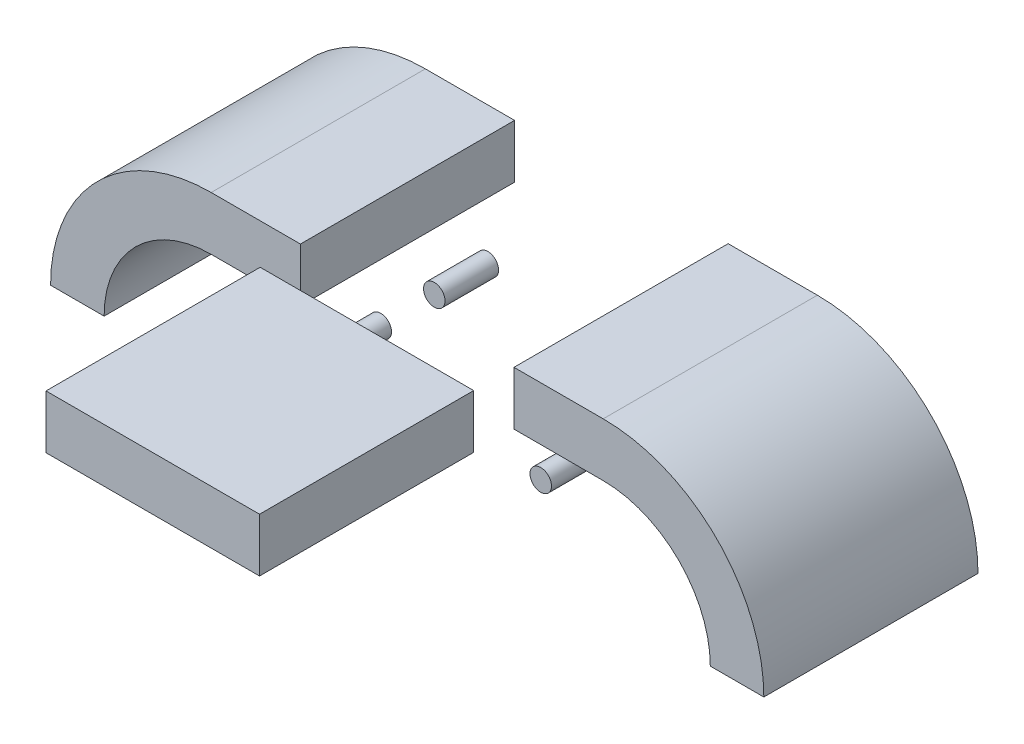
ISO-10303-21;
HEADER;
FILE_DESCRIPTION(('STEP AP214'),'2;1');
FILE_NAME('part.step','',(''),(''),'','','');
FILE_SCHEMA(('AUTOMOTIVE_DESIGN { 1 0 10303 214 1 1 1 1 }'));
ENDSEC;
DATA;
#1=APPLICATION_CONTEXT('core data for automotive mechanical design processes');
#2=APPLICATION_PROTOCOL_DEFINITION('international standard','automotive_design',2000,#1);
#3=PRODUCT_CONTEXT('',#1,'mechanical');
#4=PRODUCT('Part','Part','',(#3));
#5=PRODUCT_RELATED_PRODUCT_CATEGORY('part','',(#4));
#6=PRODUCT_DEFINITION_FORMATION('','',#4);
#7=PRODUCT_DEFINITION_CONTEXT('part definition',#1,'design');
#8=PRODUCT_DEFINITION('design','',#6,#7);
#9=PRODUCT_DEFINITION_SHAPE('','',#8);
#10=(LENGTH_UNIT() NAMED_UNIT(*) SI_UNIT(.MILLI.,.METRE.));
#11=(NAMED_UNIT(*) PLANE_ANGLE_UNIT() SI_UNIT($,.RADIAN.));
#12=(NAMED_UNIT(*) SI_UNIT($,.STERADIAN.) SOLID_ANGLE_UNIT());
#13=UNCERTAINTY_MEASURE_WITH_UNIT(LENGTH_MEASURE(1.E-05),#10,'distance_accuracy_value','');
#14=(GEOMETRIC_REPRESENTATION_CONTEXT(3) GLOBAL_UNCERTAINTY_ASSIGNED_CONTEXT((#13)) GLOBAL_UNIT_ASSIGNED_CONTEXT((#10,
#11,#12)) REPRESENTATION_CONTEXT('',''));
#15=CARTESIAN_POINT('',(0.,0.,0.));
#16=DIRECTION('',(0.,0.,1.));
#17=DIRECTION('',(1.,0.,0.));
#18=AXIS2_PLACEMENT_3D('',#15,#16,#17);
#19=CARTESIAN_POINT('',(23.9298245614035,-12.8509453871512,30.));
#20=DIRECTION('',(0.,0.,1.));
#21=DIRECTION('',(1.,0.,0.));
#22=AXIS2_PLACEMENT_3D('',#19,#20,#21);
#23=CYLINDRICAL_SURFACE('',#22,2.40989608573421);
#24=CARTESIAN_POINT('',(23.9298245614035,-12.8509453871512,30.));
#25=DIRECTION('',(0.,0.,-1.));
#26=DIRECTION('',(-1.,0.,0.));
#27=AXIS2_PLACEMENT_3D('',#24,#25,#26);
#28=CIRCLE('',#27,2.40989608573421);
#29=CARTESIAN_POINT('',(21.5199284756693,-12.8509453871512,30.));
#30=VERTEX_POINT('',#29);
#31=EDGE_CURVE('E11',#30,#30,#28,.T.);
#32=ORIENTED_EDGE('',*,*,#31,.F.);
#33=EDGE_LOOP('',(#32));
#34=FACE_BOUND('',#33,.T.);
#35=CARTESIAN_POINT('',(23.9298245614035,-12.8509453871512,42.));
#36=DIRECTION('',(0.,0.,-1.));
#37=DIRECTION('',(-1.,0.,0.));
#38=AXIS2_PLACEMENT_3D('',#35,#36,#37);
#39=CIRCLE('',#38,2.40989608573421);
#40=CARTESIAN_POINT('',(21.5199284756693,-12.8509453871512,42.));
#41=VERTEX_POINT('',#40);
#42=EDGE_CURVE('E49',#41,#41,#39,.T.);
#43=ORIENTED_EDGE('',*,*,#42,.T.);
#44=EDGE_LOOP('',(#43));
#45=FACE_BOUND('',#44,.T.);
#46=ADVANCED_FACE('F46',(#34,#45),#23,.T.);
#47=CARTESIAN_POINT('',(23.9298245614035,-12.8509453871512,30.));
#48=DIRECTION('',(0.,0.,-1.));
#49=DIRECTION('',(-1.,0.,0.));
#50=AXIS2_PLACEMENT_3D('',#47,#48,#49);
#51=PLANE('',#50);
#52=ORIENTED_EDGE('',*,*,#31,.T.);
#53=EDGE_LOOP('',(#52));
#54=FACE_BOUND('',#53,.T.);
#55=ADVANCED_FACE('F61',(#54),#51,.T.);
#56=CARTESIAN_POINT('',(23.9298245614035,-12.8509453871512,42.));
#57=DIRECTION('',(0.,0.,-1.));
#58=DIRECTION('',(-1.,0.,0.));
#59=AXIS2_PLACEMENT_3D('',#56,#57,#58);
#60=PLANE('',#59);
#61=ORIENTED_EDGE('',*,*,#42,.F.);
#62=EDGE_LOOP('',(#61));
#63=FACE_BOUND('',#62,.T.);
#64=ADVANCED_FACE('F59',(#63),#60,.F.);
#65=CLOSED_SHELL('',(#46,#55,#64));
#66=MANIFOLD_SOLID_BREP('B2',#65);
#67=CARTESIAN_POINT('',(23.9298245614035,-12.8509453871512,18.));
#68=DIRECTION('',(0.,0.,-1.));
#69=DIRECTION('',(1.,0.,0.));
#70=AXIS2_PLACEMENT_3D('',#67,#68,#69);
#71=CYLINDRICAL_SURFACE('',#70,2.40989608573421);
#72=CARTESIAN_POINT('',(23.9298245614035,-12.8509453871512,18.));
#73=DIRECTION('',(0.,0.,-1.));
#74=DIRECTION('',(-1.,0.,0.));
#75=AXIS2_PLACEMENT_3D('',#72,#73,#74);
#76=CIRCLE('',#75,2.40989608573421);
#77=CARTESIAN_POINT('',(21.5199284756693,-12.8509453871512,18.));
#78=VERTEX_POINT('',#77);
#79=EDGE_CURVE('E45',#78,#78,#76,.T.);
#80=ORIENTED_EDGE('',*,*,#79,.T.);
#81=EDGE_LOOP('',(#80));
#82=FACE_BOUND('',#81,.T.);
#83=CARTESIAN_POINT('',(23.9298245614035,-12.8509453871512,6.));
#84=DIRECTION('',(0.,0.,-1.));
#85=DIRECTION('',(-1.,0.,0.));
#86=AXIS2_PLACEMENT_3D('',#83,#84,#85);
#87=CIRCLE('',#86,2.40989608573421);
#88=CARTESIAN_POINT('',(21.5199284756693,-12.8509453871512,6.));
#89=VERTEX_POINT('',#88);
#90=EDGE_CURVE('E98',#89,#89,#87,.T.);
#91=ORIENTED_EDGE('',*,*,#90,.F.);
#92=EDGE_LOOP('',(#91));
#93=FACE_BOUND('',#92,.T.);
#94=ADVANCED_FACE('F95',(#82,#93),#71,.T.);
#95=CARTESIAN_POINT('',(23.9298245614035,-12.8509453871512,18.));
#96=DIRECTION('',(0.,0.,1.));
#97=DIRECTION('',(-1.,0.,0.));
#98=AXIS2_PLACEMENT_3D('',#95,#96,#97);
#99=PLANE('',#98);
#100=ORIENTED_EDGE('',*,*,#79,.F.);
#101=EDGE_LOOP('',(#100));
#102=FACE_BOUND('',#101,.T.);
#103=ADVANCED_FACE('F110',(#102),#99,.T.);
#104=CARTESIAN_POINT('',(23.9298245614035,-12.8509453871512,6.));
#105=DIRECTION('',(0.,0.,1.));
#106=DIRECTION('',(-1.,0.,0.));
#107=AXIS2_PLACEMENT_3D('',#104,#105,#106);
#108=PLANE('',#107);
#109=ORIENTED_EDGE('',*,*,#90,.T.);
#110=EDGE_LOOP('',(#109));
#111=FACE_BOUND('',#110,.T.);
#112=ADVANCED_FACE('F107',(#111),#108,.F.);
#113=CLOSED_SHELL('',(#94,#103,#112));
#114=MANIFOLD_SOLID_BREP('B6',#113);
#115=CARTESIAN_POINT('',(-23.9298245614035,-12.8509453871512,30.));
#116=DIRECTION('',(0.,0.,1.));
#117=DIRECTION('',(-1.,0.,0.));
#118=AXIS2_PLACEMENT_3D('',#115,#116,#117);
#119=CYLINDRICAL_SURFACE('',#118,2.40989608573421);
#120=CARTESIAN_POINT('',(-23.9298245614035,-12.8509453871512,30.));
#121=DIRECTION('',(0.,0.,1.));
#122=DIRECTION('',(1.,0.,0.));
#123=AXIS2_PLACEMENT_3D('',#120,#121,#122);
#124=CIRCLE('',#123,2.40989608573421);
#125=CARTESIAN_POINT('',(-21.5199284756693,-12.8509453871512,30.));
#126=VERTEX_POINT('',#125);
#127=EDGE_CURVE('E94',#126,#126,#124,.T.);
#128=ORIENTED_EDGE('',*,*,#127,.T.);
#129=EDGE_LOOP('',(#128));
#130=FACE_BOUND('',#129,.T.);
#131=CARTESIAN_POINT('',(-23.9298245614035,-12.8509453871512,42.));
#132=DIRECTION('',(0.,0.,1.));
#133=DIRECTION('',(1.,0.,0.));
#134=AXIS2_PLACEMENT_3D('',#131,#132,#133);
#135=CIRCLE('',#134,2.40989608573421);
#136=CARTESIAN_POINT('',(-21.5199284756693,-12.8509453871512,42.));
#137=VERTEX_POINT('',#136);
#138=EDGE_CURVE('E147',#137,#137,#135,.T.);
#139=ORIENTED_EDGE('',*,*,#138,.F.);
#140=EDGE_LOOP('',(#139));
#141=FACE_BOUND('',#140,.T.);
#142=ADVANCED_FACE('F144',(#130,#141),#119,.T.);
#143=CARTESIAN_POINT('',(-23.9298245614035,-12.8509453871512,30.));
#144=DIRECTION('',(0.,0.,-1.));
#145=DIRECTION('',(1.,0.,0.));
#146=AXIS2_PLACEMENT_3D('',#143,#144,#145);
#147=PLANE('',#146);
#148=ORIENTED_EDGE('',*,*,#127,.F.);
#149=EDGE_LOOP('',(#148));
#150=FACE_BOUND('',#149,.T.);
#151=ADVANCED_FACE('F159',(#150),#147,.T.);
#152=CARTESIAN_POINT('',(-23.9298245614035,-12.8509453871512,42.));
#153=DIRECTION('',(0.,0.,-1.));
#154=DIRECTION('',(1.,0.,0.));
#155=AXIS2_PLACEMENT_3D('',#152,#153,#154);
#156=PLANE('',#155);
#157=ORIENTED_EDGE('',*,*,#138,.T.);
#158=EDGE_LOOP('',(#157));
#159=FACE_BOUND('',#158,.T.);
#160=ADVANCED_FACE('F156',(#159),#156,.F.);
#161=CLOSED_SHELL('',(#142,#151,#160));
#162=MANIFOLD_SOLID_BREP('B40',#161);
#163=CARTESIAN_POINT('',(-23.9298245614035,-12.8509453871512,18.));
#164=DIRECTION('',(0.,0.,-1.));
#165=DIRECTION('',(-1.,0.,0.));
#166=AXIS2_PLACEMENT_3D('',#163,#164,#165);
#167=CYLINDRICAL_SURFACE('',#166,2.40989608573421);
#168=CARTESIAN_POINT('',(-23.9298245614035,-12.8509453871512,18.));
#169=DIRECTION('',(0.,0.,1.));
#170=DIRECTION('',(1.,0.,0.));
#171=AXIS2_PLACEMENT_3D('',#168,#169,#170);
#172=CIRCLE('',#171,2.40989608573421);
#173=CARTESIAN_POINT('',(-21.5199284756693,-12.8509453871512,18.));
#174=VERTEX_POINT('',#173);
#175=EDGE_CURVE('E143',#174,#174,#172,.T.);
#176=ORIENTED_EDGE('',*,*,#175,.F.);
#177=EDGE_LOOP('',(#176));
#178=FACE_BOUND('',#177,.T.);
#179=CARTESIAN_POINT('',(-23.9298245614035,-12.8509453871512,6.));
#180=DIRECTION('',(0.,0.,1.));
#181=DIRECTION('',(1.,0.,0.));
#182=AXIS2_PLACEMENT_3D('',#179,#180,#181);
#183=CIRCLE('',#182,2.40989608573421);
#184=CARTESIAN_POINT('',(-21.5199284756693,-12.8509453871512,6.));
#185=VERTEX_POINT('',#184);
#186=EDGE_CURVE('E198',#185,#185,#183,.T.);
#187=ORIENTED_EDGE('',*,*,#186,.T.);
#188=EDGE_LOOP('',(#187));
#189=FACE_BOUND('',#188,.T.);
#190=ADVANCED_FACE('F195',(#178,#189),#167,.T.);
#191=CARTESIAN_POINT('',(-23.9298245614035,-12.8509453871512,18.));
#192=DIRECTION('',(0.,0.,1.));
#193=DIRECTION('',(1.,0.,0.));
#194=AXIS2_PLACEMENT_3D('',#191,#192,#193);
#195=PLANE('',#194);
#196=ORIENTED_EDGE('',*,*,#175,.T.);
#197=EDGE_LOOP('',(#196));
#198=FACE_BOUND('',#197,.T.);
#199=ADVANCED_FACE('F210',(#198),#195,.T.);
#200=CARTESIAN_POINT('',(-23.9298245614035,-12.8509453871512,6.));
#201=DIRECTION('',(0.,0.,1.));
#202=DIRECTION('',(1.,0.,0.));
#203=AXIS2_PLACEMENT_3D('',#200,#201,#202);
#204=PLANE('',#203);
#205=ORIENTED_EDGE('',*,*,#186,.F.);
#206=EDGE_LOOP('',(#205));
#207=FACE_BOUND('',#206,.T.);
#208=ADVANCED_FACE('F208',(#207),#204,.F.);
#209=CLOSED_SHELL('',(#190,#199,#208));
#210=MANIFOLD_SOLID_BREP('B89',#209);
#211=CARTESIAN_POINT('',(-23.9298245614035,12.,105.024626708994));
#212=DIRECTION('',(1.,0.,0.));
#213=DIRECTION('',(0.,0.,-1.));
#214=AXIS2_PLACEMENT_3D('',#211,#212,#213);
#215=PLANE('',#214);
#216=DIRECTION('',(0.,0.,1.));
#217=VECTOR('',#216,1.);
#218=CARTESIAN_POINT('',(-23.9298245614035,0.,105.024626708994));
#219=LINE('',#218,#217);
#220=CARTESIAN_POINT('',(-23.9298245614035,0.,57.0246267089942));
#221=VERTEX_POINT('',#220);
#222=CARTESIAN_POINT('',(-23.9298245614035,0.,105.024626708994));
#223=VERTEX_POINT('',#222);
#224=EDGE_CURVE('E309',#221,#223,#219,.T.);
#225=ORIENTED_EDGE('',*,*,#224,.T.);
#226=DIRECTION('',(0.,-1.,0.));
#227=VECTOR('',#226,1.);
#228=CARTESIAN_POINT('',(-23.9298245614035,12.,105.024626708994));
#229=LINE('',#228,#227);
#230=CARTESIAN_POINT('',(-23.9298245614035,12.,105.024626708994));
#231=VERTEX_POINT('',#230);
#232=EDGE_CURVE('E193',#231,#223,#229,.T.);
#233=ORIENTED_EDGE('',*,*,#232,.F.);
#234=DIRECTION('',(0.,0.,1.));
#235=VECTOR('',#234,1.);
#236=CARTESIAN_POINT('',(-23.9298245614035,12.,105.024626708994));
#237=LINE('',#236,#235);
#238=CARTESIAN_POINT('',(-23.9298245614035,12.,57.0246267089942));
#239=VERTEX_POINT('',#238);
#240=EDGE_CURVE('E297',#239,#231,#237,.T.);
#241=ORIENTED_EDGE('',*,*,#240,.F.);
#242=DIRECTION('',(0.,-1.,0.));
#243=VECTOR('',#242,1.);
#244=CARTESIAN_POINT('',(-23.9298245614035,12.,57.0246267089942));
#245=LINE('',#244,#243);
#246=EDGE_CURVE('E305',#239,#221,#245,.T.);
#247=ORIENTED_EDGE('',*,*,#246,.T.);
#248=EDGE_LOOP('',(#225,#233,#241,#247));
#249=FACE_BOUND('',#248,.T.);
#250=ADVANCED_FACE('F246',(#249),#215,.F.);
#251=CARTESIAN_POINT('',(-23.9298245614035,12.,105.024626708994));
#252=DIRECTION('',(0.,0.,-1.));
#253=DIRECTION('',(-1.,0.,0.));
#254=AXIS2_PLACEMENT_3D('',#251,#252,#253);
#255=PLANE('',#254);
#256=DIRECTION('',(1.,0.,0.));
#257=VECTOR('',#256,1.);
#258=CARTESIAN_POINT('',(-23.9298245614035,0.,105.024626708994));
#259=LINE('',#258,#257);
#260=CARTESIAN_POINT('',(23.9298245614035,0.,105.024626708994));
#261=VERTEX_POINT('',#260);
#262=EDGE_CURVE('E301',#223,#261,#259,.T.);
#263=ORIENTED_EDGE('',*,*,#262,.T.);
#264=DIRECTION('',(0.,-1.,0.));
#265=VECTOR('',#264,1.);
#266=CARTESIAN_POINT('',(23.9298245614035,12.,105.024626708994));
#267=LINE('',#266,#265);
#268=CARTESIAN_POINT('',(23.9298245614035,12.,105.024626708994));
#269=VERTEX_POINT('',#268);
#270=EDGE_CURVE('E254',#269,#261,#267,.T.);
#271=ORIENTED_EDGE('',*,*,#270,.F.);
#272=DIRECTION('',(1.,0.,0.));
#273=VECTOR('',#272,1.);
#274=CARTESIAN_POINT('',(-23.9298245614035,12.,105.024626708994));
#275=LINE('',#274,#273);
#276=EDGE_CURVE('E292',#231,#269,#275,.T.);
#277=ORIENTED_EDGE('',*,*,#276,.F.);
#278=ORIENTED_EDGE('',*,*,#232,.T.);
#279=EDGE_LOOP('',(#263,#271,#277,#278));
#280=FACE_BOUND('',#279,.T.);
#281=ADVANCED_FACE('F300',(#280),#255,.F.);
#282=CARTESIAN_POINT('',(23.9298245614035,12.,105.024626708994));
#283=DIRECTION('',(-1.,0.,0.));
#284=DIRECTION('',(0.,0.,1.));
#285=AXIS2_PLACEMENT_3D('',#282,#283,#284);
#286=PLANE('',#285);
#287=DIRECTION('',(0.,0.,-1.));
#288=VECTOR('',#287,1.);
#289=CARTESIAN_POINT('',(23.9298245614035,0.,105.024626708994));
#290=LINE('',#289,#288);
#291=CARTESIAN_POINT('',(23.9298245614035,0.,57.0246267089942));
#292=VERTEX_POINT('',#291);
#293=EDGE_CURVE('E279',#261,#292,#290,.T.);
#294=ORIENTED_EDGE('',*,*,#293,.T.);
#295=DIRECTION('',(0.,-1.,0.));
#296=VECTOR('',#295,1.);
#297=CARTESIAN_POINT('',(23.9298245614035,12.,57.0246267089942));
#298=LINE('',#297,#296);
#299=CARTESIAN_POINT('',(23.9298245614035,12.,57.0246267089942));
#300=VERTEX_POINT('',#299);
#301=EDGE_CURVE('E302',#300,#292,#298,.T.);
#302=ORIENTED_EDGE('',*,*,#301,.F.);
#303=DIRECTION('',(0.,0.,-1.));
#304=VECTOR('',#303,1.);
#305=CARTESIAN_POINT('',(23.9298245614035,12.,105.024626708994));
#306=LINE('',#305,#304);
#307=EDGE_CURVE('E295',#269,#300,#306,.T.);
#308=ORIENTED_EDGE('',*,*,#307,.F.);
#309=ORIENTED_EDGE('',*,*,#270,.T.);
#310=EDGE_LOOP('',(#294,#302,#308,#309));
#311=FACE_BOUND('',#310,.T.);
#312=ADVANCED_FACE('F303',(#311),#286,.F.);
#313=CARTESIAN_POINT('',(-23.9298245614035,12.,57.0246267089942));
#314=DIRECTION('',(0.,0.,1.));
#315=DIRECTION('',(1.,0.,0.));
#316=AXIS2_PLACEMENT_3D('',#313,#314,#315);
#317=PLANE('',#316);
#318=DIRECTION('',(-1.,0.,0.));
#319=VECTOR('',#318,1.);
#320=CARTESIAN_POINT('',(-23.9298245614035,0.,57.0246267089942));
#321=LINE('',#320,#319);
#322=EDGE_CURVE('E285',#292,#221,#321,.T.);
#323=ORIENTED_EDGE('',*,*,#322,.T.);
#324=ORIENTED_EDGE('',*,*,#246,.F.);
#325=DIRECTION('',(-1.,0.,0.));
#326=VECTOR('',#325,1.);
#327=CARTESIAN_POINT('',(-23.9298245614035,12.,57.0246267089942));
#328=LINE('',#327,#326);
#329=EDGE_CURVE('E262',#300,#239,#328,.T.);
#330=ORIENTED_EDGE('',*,*,#329,.F.);
#331=ORIENTED_EDGE('',*,*,#301,.T.);
#332=EDGE_LOOP('',(#323,#324,#330,#331));
#333=FACE_BOUND('',#332,.T.);
#334=ADVANCED_FACE('F316',(#333),#317,.F.);
#335=CARTESIAN_POINT('',(0.,12.,0.));
#336=DIRECTION('',(0.,-1.,0.));
#337=DIRECTION('',(0.,0.,-1.));
#338=AXIS2_PLACEMENT_3D('',#335,#336,#337);
#339=PLANE('',#338);
#340=ORIENTED_EDGE('',*,*,#240,.T.);
#341=ORIENTED_EDGE('',*,*,#276,.T.);
#342=ORIENTED_EDGE('',*,*,#307,.T.);
#343=ORIENTED_EDGE('',*,*,#329,.T.);
#344=EDGE_LOOP('',(#340,#341,#342,#343));
#345=FACE_BOUND('',#344,.T.);
#346=ADVANCED_FACE('F293',(#345),#339,.F.);
#347=CARTESIAN_POINT('',(0.,0.,0.));
#348=DIRECTION('',(0.,-1.,0.));
#349=DIRECTION('',(0.,0.,-1.));
#350=AXIS2_PLACEMENT_3D('',#347,#348,#349);
#351=PLANE('',#350);
#352=ORIENTED_EDGE('',*,*,#224,.F.);
#353=ORIENTED_EDGE('',*,*,#322,.F.);
#354=ORIENTED_EDGE('',*,*,#293,.F.);
#355=ORIENTED_EDGE('',*,*,#262,.F.);
#356=EDGE_LOOP('',(#352,#353,#354,#355));
#357=FACE_BOUND('',#356,.T.);
#358=ADVANCED_FACE('F319',(#357),#351,.T.);
#359=CLOSED_SHELL('',(#250,#281,#312,#334,#346,#358));
#360=MANIFOLD_SOLID_BREP('B138',#359);
#361=CARTESIAN_POINT('',(-23.9298245614035,0.,48.));
#362=DIRECTION('',(-1.,0.,0.));
#363=DIRECTION('',(0.,0.,-1.));
#364=AXIS2_PLACEMENT_3D('',#361,#362,#363);
#365=PLANE('',#364);
#366=DIRECTION('',(0.,-1.,0.));
#367=VECTOR('',#366,1.);
#368=CARTESIAN_POINT('',(-23.9298245614035,0.,0.));
#369=LINE('',#368,#367);
#370=CARTESIAN_POINT('',(-23.9298245614035,12.,0.));
#371=VERTEX_POINT('',#370);
#372=CARTESIAN_POINT('',(-23.9298245614035,0.,0.));
#373=VERTEX_POINT('',#372);
#374=EDGE_CURVE('E456',#371,#373,#369,.T.);
#375=ORIENTED_EDGE('',*,*,#374,.F.);
#376=DIRECTION('',(0.,0.,-1.));
#377=VECTOR('',#376,1.);
#378=CARTESIAN_POINT('',(-23.9298245614035,12.,48.));
#379=LINE('',#378,#377);
#380=CARTESIAN_POINT('',(-23.9298245614035,12.,48.));
#381=VERTEX_POINT('',#380);
#382=EDGE_CURVE('E464',#381,#371,#379,.T.);
#383=ORIENTED_EDGE('',*,*,#382,.F.);
#384=DIRECTION('',(0.,-1.,0.));
#385=VECTOR('',#384,1.);
#386=CARTESIAN_POINT('',(-23.9298245614035,0.,48.));
#387=LINE('',#386,#385);
#388=CARTESIAN_POINT('',(-23.9298245614035,0.,48.));
#389=VERTEX_POINT('',#388);
#390=EDGE_CURVE('E458',#381,#389,#387,.T.);
#391=ORIENTED_EDGE('',*,*,#390,.T.);
#392=DIRECTION('',(0.,0.,-1.));
#393=VECTOR('',#392,1.);
#394=CARTESIAN_POINT('',(-23.9298245614035,0.,48.));
#395=LINE('',#394,#393);
#396=EDGE_CURVE('E244',#389,#373,#395,.T.);
#397=ORIENTED_EDGE('',*,*,#396,.T.);
#398=EDGE_LOOP('',(#375,#383,#391,#397));
#399=FACE_BOUND('',#398,.T.);
#400=ADVANCED_FACE('F379',(#399),#365,.F.);
#401=CARTESIAN_POINT('',(-23.9298245614035,0.,48.));
#402=DIRECTION('',(0.,1.,0.));
#403=DIRECTION('',(0.,0.,1.));
#404=AXIS2_PLACEMENT_3D('',#401,#402,#403);
#405=PLANE('',#404);
#406=DIRECTION('',(-1.,0.,0.));
#407=VECTOR('',#406,1.);
#408=CARTESIAN_POINT('',(-23.9298245614035,0.,0.));
#409=LINE('',#408,#407);
#410=CARTESIAN_POINT('',(-43.9298245614035,0.,0.));
#411=VERTEX_POINT('',#410);
#412=EDGE_CURVE('E452',#373,#411,#409,.T.);
#413=ORIENTED_EDGE('',*,*,#412,.F.);
#414=ORIENTED_EDGE('',*,*,#396,.F.);
#415=DIRECTION('',(-1.,0.,0.));
#416=VECTOR('',#415,1.);
#417=CARTESIAN_POINT('',(-23.9298245614035,0.,48.));
#418=LINE('',#417,#416);
#419=CARTESIAN_POINT('',(-43.9298245614035,0.,48.));
#420=VERTEX_POINT('',#419);
#421=EDGE_CURVE('E422',#389,#420,#418,.T.);
#422=ORIENTED_EDGE('',*,*,#421,.T.);
#423=DIRECTION('',(0.,0.,-1.));
#424=VECTOR('',#423,1.);
#425=CARTESIAN_POINT('',(-43.9298245614035,0.,48.));
#426=LINE('',#425,#424);
#427=EDGE_CURVE('E387',#420,#411,#426,.T.);
#428=ORIENTED_EDGE('',*,*,#427,.T.);
#429=EDGE_LOOP('',(#413,#414,#422,#428));
#430=FACE_BOUND('',#429,.T.);
#431=ADVANCED_FACE('F451',(#430),#405,.F.);
#432=CARTESIAN_POINT('',(-23.9298245614035,12.,48.));
#433=DIRECTION('',(0.,-1.,0.));
#434=DIRECTION('',(0.,0.,-1.));
#435=AXIS2_PLACEMENT_3D('',#432,#433,#434);
#436=PLANE('',#435);
#437=DIRECTION('',(1.,0.,0.));
#438=VECTOR('',#437,1.);
#439=CARTESIAN_POINT('',(-23.9298245614035,12.,0.));
#440=LINE('',#439,#438);
#441=CARTESIAN_POINT('',(-43.9298245614035,12.,0.));
#442=VERTEX_POINT('',#441);
#443=EDGE_CURVE('E416',#442,#371,#440,.T.);
#444=ORIENTED_EDGE('',*,*,#443,.F.);
#445=DIRECTION('',(0.,0.,-1.));
#446=VECTOR('',#445,1.);
#447=CARTESIAN_POINT('',(-43.9298245614035,12.,48.));
#448=LINE('',#447,#446);
#449=CARTESIAN_POINT('',(-43.9298245614035,12.,48.));
#450=VERTEX_POINT('',#449);
#451=EDGE_CURVE('E453',#450,#442,#448,.T.);
#452=ORIENTED_EDGE('',*,*,#451,.F.);
#453=DIRECTION('',(1.,0.,0.));
#454=VECTOR('',#453,1.);
#455=CARTESIAN_POINT('',(-23.9298245614035,12.,48.));
#456=LINE('',#455,#454);
#457=EDGE_CURVE('E395',#450,#381,#456,.T.);
#458=ORIENTED_EDGE('',*,*,#457,.T.);
#459=ORIENTED_EDGE('',*,*,#382,.T.);
#460=EDGE_LOOP('',(#444,#452,#458,#459));
#461=FACE_BOUND('',#460,.T.);
#462=ADVANCED_FACE('F470',(#461),#436,.F.);
#463=CARTESIAN_POINT('',(0.,0.,48.));
#464=DIRECTION('',(0.,0.,-1.));
#465=DIRECTION('',(1.,0.,0.));
#466=AXIS2_PLACEMENT_3D('',#463,#464,#465);
#467=PLANE('',#466);
#468=ORIENTED_EDGE('',*,*,#390,.F.);
#469=ORIENTED_EDGE('',*,*,#457,.F.);
#470=CARTESIAN_POINT('',(-43.9298245614035,-24.,48.));
#471=DIRECTION('',(0.,0.,-1.));
#472=DIRECTION('',(1.,0.,0.));
#473=AXIS2_PLACEMENT_3D('',#470,#471,#472);
#474=CIRCLE('',#473,36.);
#475=CARTESIAN_POINT('',(-79.9298245614035,-24.,48.));
#476=VERTEX_POINT('',#475);
#477=EDGE_CURVE('E469',#476,#450,#474,.T.);
#478=ORIENTED_EDGE('',*,*,#477,.F.);
#479=DIRECTION('',(-1.,0.,0.));
#480=VECTOR('',#479,1.);
#481=CARTESIAN_POINT('',(-67.9298245614035,-24.,48.));
#482=LINE('',#481,#480);
#483=CARTESIAN_POINT('',(-67.9298245614035,-24.,48.));
#484=VERTEX_POINT('',#483);
#485=EDGE_CURVE('E479',#484,#476,#482,.T.);
#486=ORIENTED_EDGE('',*,*,#485,.F.);
#487=CARTESIAN_POINT('',(-43.9298245614035,-24.,48.));
#488=DIRECTION('',(0.,0.,1.));
#489=DIRECTION('',(1.,0.,0.));
#490=AXIS2_PLACEMENT_3D('',#487,#488,#489);
#491=CIRCLE('',#490,24.);
#492=EDGE_CURVE('E482',#420,#484,#491,.T.);
#493=ORIENTED_EDGE('',*,*,#492,.F.);
#494=ORIENTED_EDGE('',*,*,#421,.F.);
#495=EDGE_LOOP('',(#468,#469,#478,#486,#493,#494));
#496=FACE_BOUND('',#495,.T.);
#497=ADVANCED_FACE('F489',(#496),#467,.F.);
#498=CARTESIAN_POINT('',(0.,0.,0.));
#499=DIRECTION('',(0.,0.,-1.));
#500=DIRECTION('',(1.,0.,0.));
#501=AXIS2_PLACEMENT_3D('',#498,#499,#500);
#502=PLANE('',#501);
#503=ORIENTED_EDGE('',*,*,#374,.T.);
#504=ORIENTED_EDGE('',*,*,#412,.T.);
#505=CARTESIAN_POINT('',(-43.9298245614035,-24.,0.));
#506=DIRECTION('',(0.,0.,1.));
#507=DIRECTION('',(1.,0.,0.));
#508=AXIS2_PLACEMENT_3D('',#505,#506,#507);
#509=CIRCLE('',#508,24.);
#510=CARTESIAN_POINT('',(-67.9298245614035,-24.,0.));
#511=VERTEX_POINT('',#510);
#512=EDGE_CURVE('E441',#411,#511,#509,.T.);
#513=ORIENTED_EDGE('',*,*,#512,.T.);
#514=DIRECTION('',(-1.,0.,0.));
#515=VECTOR('',#514,1.);
#516=CARTESIAN_POINT('',(-67.9298245614035,-24.,0.));
#517=LINE('',#516,#515);
#518=CARTESIAN_POINT('',(-79.9298245614035,-24.,0.));
#519=VERTEX_POINT('',#518);
#520=EDGE_CURVE('E448',#511,#519,#517,.T.);
#521=ORIENTED_EDGE('',*,*,#520,.T.);
#522=CARTESIAN_POINT('',(-43.9298245614035,-24.,0.));
#523=DIRECTION('',(0.,0.,-1.));
#524=DIRECTION('',(1.,0.,0.));
#525=AXIS2_PLACEMENT_3D('',#522,#523,#524);
#526=CIRCLE('',#525,36.);
#527=EDGE_CURVE('E411',#519,#442,#526,.T.);
#528=ORIENTED_EDGE('',*,*,#527,.T.);
#529=ORIENTED_EDGE('',*,*,#443,.T.);
#530=EDGE_LOOP('',(#503,#504,#513,#521,#528,#529));
#531=FACE_BOUND('',#530,.T.);
#532=ADVANCED_FACE('F454',(#531),#502,.T.);
#533=CARTESIAN_POINT('',(-43.9298245614035,-24.,0.));
#534=DIRECTION('',(0.,0.,1.));
#535=DIRECTION('',(-1.,0.,0.));
#536=AXIS2_PLACEMENT_3D('',#533,#534,#535);
#537=CYLINDRICAL_SURFACE('',#536,36.);
#538=ORIENTED_EDGE('',*,*,#477,.T.);
#539=ORIENTED_EDGE('',*,*,#451,.T.);
#540=ORIENTED_EDGE('',*,*,#527,.F.);
#541=DIRECTION('',(0.,0.,1.));
#542=VECTOR('',#541,1.);
#543=CARTESIAN_POINT('',(-79.9298245614035,-24.,0.));
#544=LINE('',#543,#542);
#545=EDGE_CURVE('E460',#519,#476,#544,.T.);
#546=ORIENTED_EDGE('',*,*,#545,.T.);
#547=EDGE_LOOP('',(#538,#539,#540,#546));
#548=FACE_BOUND('',#547,.T.);
#549=ADVANCED_FACE('F467',(#548),#537,.T.);
#550=CARTESIAN_POINT('',(-67.9298245614035,-24.,0.));
#551=DIRECTION('',(0.,-1.,0.));
#552=DIRECTION('',(0.,0.,-1.));
#553=AXIS2_PLACEMENT_3D('',#550,#551,#552);
#554=PLANE('',#553);
#555=ORIENTED_EDGE('',*,*,#485,.T.);
#556=ORIENTED_EDGE('',*,*,#545,.F.);
#557=ORIENTED_EDGE('',*,*,#520,.F.);
#558=DIRECTION('',(0.,0.,1.));
#559=VECTOR('',#558,1.);
#560=CARTESIAN_POINT('',(-67.9298245614035,-24.,0.));
#561=LINE('',#560,#559);
#562=EDGE_CURVE('E445',#511,#484,#561,.T.);
#563=ORIENTED_EDGE('',*,*,#562,.T.);
#564=EDGE_LOOP('',(#555,#556,#557,#563));
#565=FACE_BOUND('',#564,.T.);
#566=ADVANCED_FACE('F487',(#565),#554,.T.);
#567=CARTESIAN_POINT('',(-43.9298245614035,-24.,0.));
#568=DIRECTION('',(0.,0.,1.));
#569=DIRECTION('',(-1.,0.,0.));
#570=AXIS2_PLACEMENT_3D('',#567,#568,#569);
#571=CYLINDRICAL_SURFACE('',#570,24.);
#572=ORIENTED_EDGE('',*,*,#492,.T.);
#573=ORIENTED_EDGE('',*,*,#562,.F.);
#574=ORIENTED_EDGE('',*,*,#512,.F.);
#575=ORIENTED_EDGE('',*,*,#427,.F.);
#576=EDGE_LOOP('',(#572,#573,#574,#575));
#577=FACE_BOUND('',#576,.T.);
#578=ADVANCED_FACE('F444',(#577),#571,.F.);
#579=CLOSED_SHELL('',(#400,#431,#462,#497,#532,#549,#566,#578));
#580=MANIFOLD_SOLID_BREP('B187',#579);
#581=CARTESIAN_POINT('',(23.9298245614035,0.,48.));
#582=DIRECTION('',(1.,0.,0.));
#583=DIRECTION('',(0.,0.,-1.));
#584=AXIS2_PLACEMENT_3D('',#581,#582,#583);
#585=PLANE('',#584);
#586=DIRECTION('',(0.,-1.,0.));
#587=VECTOR('',#586,1.);
#588=CARTESIAN_POINT('',(23.9298245614035,0.,0.));
#589=LINE('',#588,#587);
#590=CARTESIAN_POINT('',(23.9298245614035,12.,0.));
#591=VERTEX_POINT('',#590);
#592=CARTESIAN_POINT('',(23.9298245614035,0.,0.));
#593=VERTEX_POINT('',#592);
#594=EDGE_CURVE('E627',#591,#593,#589,.T.);
#595=ORIENTED_EDGE('',*,*,#594,.T.);
#596=DIRECTION('',(0.,0.,-1.));
#597=VECTOR('',#596,1.);
#598=CARTESIAN_POINT('',(23.9298245614035,0.,48.));
#599=LINE('',#598,#597);
#600=CARTESIAN_POINT('',(23.9298245614035,0.,48.));
#601=VERTEX_POINT('',#600);
#602=EDGE_CURVE('E377',#601,#593,#599,.T.);
#603=ORIENTED_EDGE('',*,*,#602,.F.);
#604=DIRECTION('',(0.,-1.,0.));
#605=VECTOR('',#604,1.);
#606=CARTESIAN_POINT('',(23.9298245614035,0.,48.));
#607=LINE('',#606,#605);
#608=CARTESIAN_POINT('',(23.9298245614035,12.,48.));
#609=VERTEX_POINT('',#608);
#610=EDGE_CURVE('E665',#609,#601,#607,.T.);
#611=ORIENTED_EDGE('',*,*,#610,.F.);
#612=DIRECTION('',(0.,0.,-1.));
#613=VECTOR('',#612,1.);
#614=CARTESIAN_POINT('',(23.9298245614035,12.,48.));
#615=LINE('',#614,#613);
#616=EDGE_CURVE('E672',#609,#591,#615,.T.);
#617=ORIENTED_EDGE('',*,*,#616,.T.);
#618=EDGE_LOOP('',(#595,#603,#611,#617));
#619=FACE_BOUND('',#618,.T.);
#620=ADVANCED_FACE('F561',(#619),#585,.F.);
#621=CARTESIAN_POINT('',(23.9298245614035,0.,48.));
#622=DIRECTION('',(0.,1.,0.));
#623=DIRECTION('',(0.,0.,1.));
#624=AXIS2_PLACEMENT_3D('',#621,#622,#623);
#625=PLANE('',#624);
#626=DIRECTION('',(1.,0.,0.));
#627=VECTOR('',#626,1.);
#628=CARTESIAN_POINT('',(23.9298245614035,0.,0.));
#629=LINE('',#628,#627);
#630=CARTESIAN_POINT('',(43.9298245614035,0.,0.));
#631=VERTEX_POINT('',#630);
#632=EDGE_CURVE('E617',#593,#631,#629,.T.);
#633=ORIENTED_EDGE('',*,*,#632,.T.);
#634=DIRECTION('',(0.,0.,-1.));
#635=VECTOR('',#634,1.);
#636=CARTESIAN_POINT('',(43.9298245614035,0.,48.));
#637=LINE('',#636,#635);
#638=CARTESIAN_POINT('',(43.9298245614035,0.,48.));
#639=VERTEX_POINT('',#638);
#640=EDGE_CURVE('E570',#639,#631,#637,.T.);
#641=ORIENTED_EDGE('',*,*,#640,.F.);
#642=DIRECTION('',(1.,0.,0.));
#643=VECTOR('',#642,1.);
#644=CARTESIAN_POINT('',(23.9298245614035,0.,48.));
#645=LINE('',#644,#643);
#646=EDGE_CURVE('E602',#601,#639,#645,.T.);
#647=ORIENTED_EDGE('',*,*,#646,.F.);
#648=ORIENTED_EDGE('',*,*,#602,.T.);
#649=EDGE_LOOP('',(#633,#641,#647,#648));
#650=FACE_BOUND('',#649,.T.);
#651=ADVANCED_FACE('F619',(#650),#625,.F.);
#652=CARTESIAN_POINT('',(23.9298245614035,12.,48.));
#653=DIRECTION('',(0.,-1.,0.));
#654=DIRECTION('',(0.,0.,-1.));
#655=AXIS2_PLACEMENT_3D('',#652,#653,#654);
#656=PLANE('',#655);
#657=DIRECTION('',(-1.,0.,0.));
#658=VECTOR('',#657,1.);
#659=CARTESIAN_POINT('',(23.9298245614035,12.,0.));
#660=LINE('',#659,#658);
#661=CARTESIAN_POINT('',(43.9298245614035,12.,0.));
#662=VERTEX_POINT('',#661);
#663=EDGE_CURVE('E595',#662,#591,#660,.T.);
#664=ORIENTED_EDGE('',*,*,#663,.T.);
#665=ORIENTED_EDGE('',*,*,#616,.F.);
#666=DIRECTION('',(-1.,0.,0.));
#667=VECTOR('',#666,1.);
#668=CARTESIAN_POINT('',(23.9298245614035,12.,48.));
#669=LINE('',#668,#667);
#670=CARTESIAN_POINT('',(43.9298245614035,12.,48.));
#671=VERTEX_POINT('',#670);
#672=EDGE_CURVE('E578',#671,#609,#669,.T.);
#673=ORIENTED_EDGE('',*,*,#672,.F.);
#674=DIRECTION('',(0.,0.,-1.));
#675=VECTOR('',#674,1.);
#676=CARTESIAN_POINT('',(43.9298245614035,12.,48.));
#677=LINE('',#676,#675);
#678=EDGE_CURVE('E592',#671,#662,#677,.T.);
#679=ORIENTED_EDGE('',*,*,#678,.T.);
#680=EDGE_LOOP('',(#664,#665,#673,#679));
#681=FACE_BOUND('',#680,.T.);
#682=ADVANCED_FACE('F690',(#681),#656,.F.);
#683=CARTESIAN_POINT('',(0.,0.,48.));
#684=DIRECTION('',(0.,0.,-1.));
#685=DIRECTION('',(-1.,0.,0.));
#686=AXIS2_PLACEMENT_3D('',#683,#684,#685);
#687=PLANE('',#686);
#688=ORIENTED_EDGE('',*,*,#610,.T.);
#689=ORIENTED_EDGE('',*,*,#646,.T.);
#690=CARTESIAN_POINT('',(43.9298245614035,-24.,48.));
#691=DIRECTION('',(0.,0.,-1.));
#692=DIRECTION('',(-1.,0.,0.));
#693=AXIS2_PLACEMENT_3D('',#690,#691,#692);
#694=CIRCLE('',#693,24.);
#695=CARTESIAN_POINT('',(67.9298245614035,-24.,48.));
#696=VERTEX_POINT('',#695);
#697=EDGE_CURVE('E635',#639,#696,#694,.T.);
#698=ORIENTED_EDGE('',*,*,#697,.T.);
#699=DIRECTION('',(1.,0.,0.));
#700=VECTOR('',#699,1.);
#701=CARTESIAN_POINT('',(67.9298245614035,-24.,48.));
#702=LINE('',#701,#700);
#703=CARTESIAN_POINT('',(79.9298245614035,-24.,48.));
#704=VERTEX_POINT('',#703);
#705=EDGE_CURVE('E649',#696,#704,#702,.T.);
#706=ORIENTED_EDGE('',*,*,#705,.T.);
#707=CARTESIAN_POINT('',(43.9298245614035,-24.,48.));
#708=DIRECTION('',(0.,0.,1.));
#709=DIRECTION('',(-1.,0.,0.));
#710=AXIS2_PLACEMENT_3D('',#707,#708,#709);
#711=CIRCLE('',#710,36.);
#712=EDGE_CURVE('E652',#704,#671,#711,.T.);
#713=ORIENTED_EDGE('',*,*,#712,.T.);
#714=ORIENTED_EDGE('',*,*,#672,.T.);
#715=EDGE_LOOP('',(#688,#689,#698,#706,#713,#714));
#716=FACE_BOUND('',#715,.T.);
#717=ADVANCED_FACE('F688',(#716),#687,.F.);
#718=CARTESIAN_POINT('',(0.,0.,0.));
#719=DIRECTION('',(0.,0.,-1.));
#720=DIRECTION('',(-1.,0.,0.));
#721=AXIS2_PLACEMENT_3D('',#718,#719,#720);
#722=PLANE('',#721);
#723=ORIENTED_EDGE('',*,*,#594,.F.);
#724=ORIENTED_EDGE('',*,*,#663,.F.);
#725=CARTESIAN_POINT('',(43.9298245614035,-24.,0.));
#726=DIRECTION('',(0.,0.,1.));
#727=DIRECTION('',(-1.,0.,0.));
#728=AXIS2_PLACEMENT_3D('',#725,#726,#727);
#729=CIRCLE('',#728,36.);
#730=CARTESIAN_POINT('',(79.9298245614035,-24.,0.));
#731=VERTEX_POINT('',#730);
#732=EDGE_CURVE('E642',#731,#662,#729,.T.);
#733=ORIENTED_EDGE('',*,*,#732,.F.);
#734=DIRECTION('',(1.,0.,0.));
#735=VECTOR('',#734,1.);
#736=CARTESIAN_POINT('',(67.9298245614035,-24.,0.));
#737=LINE('',#736,#735);
#738=CARTESIAN_POINT('',(67.9298245614035,-24.,0.));
#739=VERTEX_POINT('',#738);
#740=EDGE_CURVE('E640',#739,#731,#737,.T.);
#741=ORIENTED_EDGE('',*,*,#740,.F.);
#742=CARTESIAN_POINT('',(43.9298245614035,-24.,0.));
#743=DIRECTION('',(0.,0.,-1.));
#744=DIRECTION('',(-1.,0.,0.));
#745=AXIS2_PLACEMENT_3D('',#742,#743,#744);
#746=CIRCLE('',#745,24.);
#747=EDGE_CURVE('E632',#631,#739,#746,.T.);
#748=ORIENTED_EDGE('',*,*,#747,.F.);
#749=ORIENTED_EDGE('',*,*,#632,.F.);
#750=EDGE_LOOP('',(#723,#724,#733,#741,#748,#749));
#751=FACE_BOUND('',#750,.T.);
#752=ADVANCED_FACE('F637',(#751),#722,.T.);
#753=CARTESIAN_POINT('',(43.9298245614035,-24.,0.));
#754=DIRECTION('',(0.,0.,1.));
#755=DIRECTION('',(1.,0.,0.));
#756=AXIS2_PLACEMENT_3D('',#753,#754,#755);
#757=CYLINDRICAL_SURFACE('',#756,36.);
#758=ORIENTED_EDGE('',*,*,#712,.F.);
#759=DIRECTION('',(0.,0.,1.));
#760=VECTOR('',#759,1.);
#761=CARTESIAN_POINT('',(79.9298245614035,-24.,0.));
#762=LINE('',#761,#760);
#763=EDGE_CURVE('E660',#731,#704,#762,.T.);
#764=ORIENTED_EDGE('',*,*,#763,.F.);
#765=ORIENTED_EDGE('',*,*,#732,.T.);
#766=ORIENTED_EDGE('',*,*,#678,.F.);
#767=EDGE_LOOP('',(#758,#764,#765,#766));
#768=FACE_BOUND('',#767,.T.);
#769=ADVANCED_FACE('F684',(#768),#757,.T.);
#770=CARTESIAN_POINT('',(67.9298245614035,-24.,0.));
#771=DIRECTION('',(0.,-1.,0.));
#772=DIRECTION('',(0.,0.,-1.));
#773=AXIS2_PLACEMENT_3D('',#770,#771,#772);
#774=PLANE('',#773);
#775=ORIENTED_EDGE('',*,*,#705,.F.);
#776=DIRECTION('',(0.,0.,1.));
#777=VECTOR('',#776,1.);
#778=CARTESIAN_POINT('',(67.9298245614035,-24.,0.));
#779=LINE('',#778,#777);
#780=EDGE_CURVE('E646',#739,#696,#779,.T.);
#781=ORIENTED_EDGE('',*,*,#780,.F.);
#782=ORIENTED_EDGE('',*,*,#740,.T.);
#783=ORIENTED_EDGE('',*,*,#763,.T.);
#784=EDGE_LOOP('',(#775,#781,#782,#783));
#785=FACE_BOUND('',#784,.T.);
#786=ADVANCED_FACE('F687',(#785),#774,.T.);
#787=CARTESIAN_POINT('',(43.9298245614035,-24.,0.));
#788=DIRECTION('',(0.,0.,1.));
#789=DIRECTION('',(1.,0.,0.));
#790=AXIS2_PLACEMENT_3D('',#787,#788,#789);
#791=CYLINDRICAL_SURFACE('',#790,24.);
#792=ORIENTED_EDGE('',*,*,#697,.F.);
#793=ORIENTED_EDGE('',*,*,#640,.T.);
#794=ORIENTED_EDGE('',*,*,#747,.T.);
#795=ORIENTED_EDGE('',*,*,#780,.T.);
#796=EDGE_LOOP('',(#792,#793,#794,#795));
#797=FACE_BOUND('',#796,.T.);
#798=ADVANCED_FACE('F631',(#797),#791,.F.);
#799=CLOSED_SHELL('',(#620,#651,#682,#717,#752,#769,#786,#798));
#800=MANIFOLD_SOLID_BREP('B238',#799);
#801=ADVANCED_BREP_SHAPE_REPRESENTATION('',(#18,#66,#114,#162,#210,#360,#580,#800),#14);
#802=SHAPE_DEFINITION_REPRESENTATION(#9,#801);
ENDSEC;
END-ISO-10303-21;
